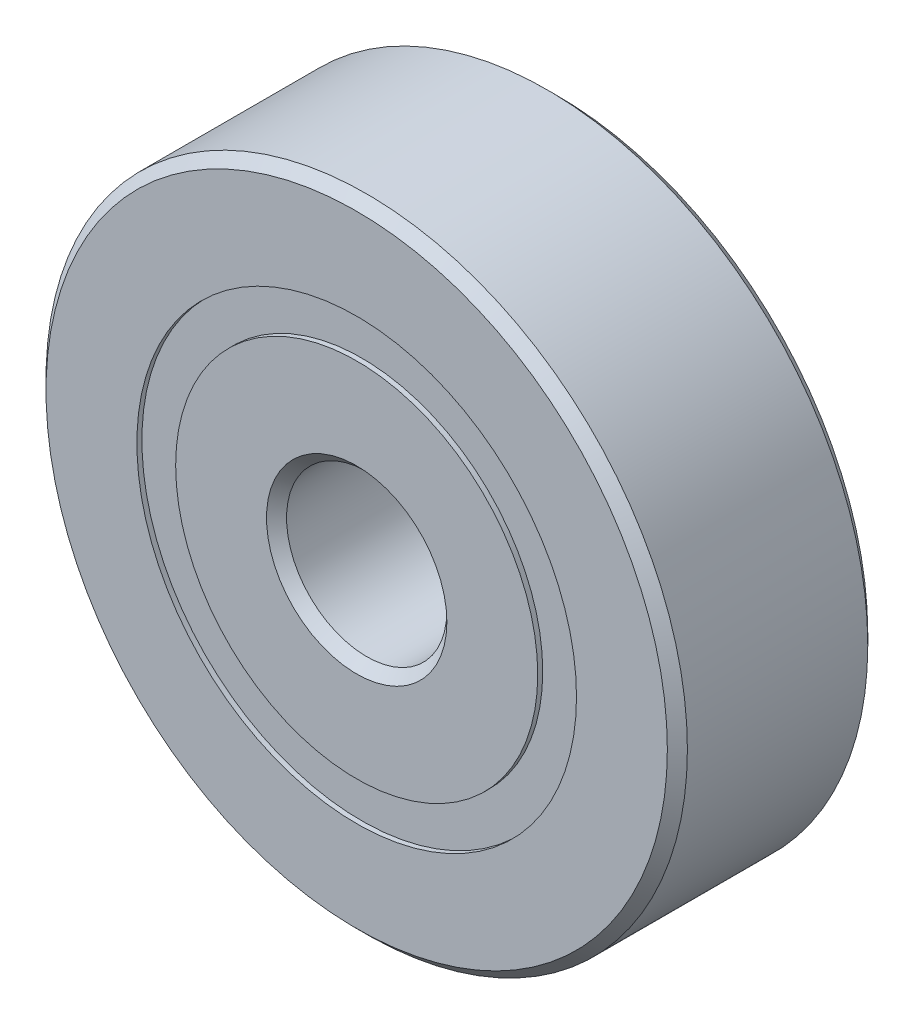
ISO-10303-21;
HEADER;
FILE_DESCRIPTION(('STEP AP214'),'2;1');
FILE_NAME('part.step','',(''),(''),'','','');
FILE_SCHEMA(('AUTOMOTIVE_DESIGN { 1 0 10303 214 1 1 1 1 }'));
ENDSEC;
DATA;
#1=APPLICATION_CONTEXT('core data for automotive mechanical design processes');
#2=APPLICATION_PROTOCOL_DEFINITION('international standard','automotive_design',2000,#1);
#3=PRODUCT_CONTEXT('',#1,'mechanical');
#4=PRODUCT('Part','Part','',(#3));
#5=PRODUCT_RELATED_PRODUCT_CATEGORY('part','',(#4));
#6=PRODUCT_DEFINITION_FORMATION('','',#4);
#7=PRODUCT_DEFINITION_CONTEXT('part definition',#1,'design');
#8=PRODUCT_DEFINITION('design','',#6,#7);
#9=PRODUCT_DEFINITION_SHAPE('','',#8);
#10=(LENGTH_UNIT() NAMED_UNIT(*) SI_UNIT(.MILLI.,.METRE.));
#11=(NAMED_UNIT(*) PLANE_ANGLE_UNIT() SI_UNIT($,.RADIAN.));
#12=(NAMED_UNIT(*) SI_UNIT($,.STERADIAN.) SOLID_ANGLE_UNIT());
#13=UNCERTAINTY_MEASURE_WITH_UNIT(LENGTH_MEASURE(1.E-05),#10,'distance_accuracy_value','');
#14=(GEOMETRIC_REPRESENTATION_CONTEXT(3) GLOBAL_UNCERTAINTY_ASSIGNED_CONTEXT((#13)) GLOBAL_UNIT_ASSIGNED_CONTEXT((#10,
#11,#12)) REPRESENTATION_CONTEXT('',''));
#15=CARTESIAN_POINT('',(0.,0.,0.));
#16=DIRECTION('',(0.,0.,1.));
#17=DIRECTION('',(1.,0.,0.));
#18=AXIS2_PLACEMENT_3D('',#15,#16,#17);
#19=CARTESIAN_POINT('',(0.,5.48351648351648,-2.375));
#20=DIRECTION('',(0.,0.,1.));
#21=DIRECTION('',(1.,0.,0.));
#22=AXIS2_PLACEMENT_3D('',#19,#20,#21);
#23=PLANE('',#22);
#24=CARTESIAN_POINT('',(0.,0.,-2.375));
#25=DIRECTION('',(0.,0.,1.));
#26=DIRECTION('',(1.,0.,0.));
#27=AXIS2_PLACEMENT_3D('',#24,#25,#26);
#28=CIRCLE('',#27,5.48351648351648);
#29=CARTESIAN_POINT('',(5.48351648351648,0.,-2.375));
#30=VERTEX_POINT('',#29);
#31=EDGE_CURVE('E57',#30,#30,#28,.T.);
#32=ORIENTED_EDGE('',*,*,#31,.F.);
#33=EDGE_LOOP('',(#32));
#34=FACE_BOUND('',#33,.T.);
#35=CARTESIAN_POINT('',(0.,0.,-2.375));
#36=DIRECTION('',(0.,0.,1.));
#37=DIRECTION('',(1.,0.,0.));
#38=AXIS2_PLACEMENT_3D('',#35,#36,#37);
#39=CIRCLE('',#38,4.51648351648352);
#40=CARTESIAN_POINT('',(4.51648351648352,0.,-2.375));
#41=VERTEX_POINT('',#40);
#42=EDGE_CURVE('E11',#41,#41,#39,.T.);
#43=ORIENTED_EDGE('',*,*,#42,.T.);
#44=EDGE_LOOP('',(#43));
#45=FACE_BOUND('',#44,.T.);
#46=ADVANCED_FACE('F43',(#34,#45),#23,.F.);
#47=CARTESIAN_POINT('',(0.,0.,2.5));
#48=DIRECTION('',(0.,0.,1.));
#49=DIRECTION('',(1.,0.,0.));
#50=AXIS2_PLACEMENT_3D('',#47,#48,#49);
#51=CYLINDRICAL_SURFACE('',#50,4.51648351648352);
#52=ORIENTED_EDGE('',*,*,#42,.F.);
#53=EDGE_LOOP('',(#52));
#54=FACE_BOUND('',#53,.T.);
#55=CARTESIAN_POINT('',(0.,0.,-1.21175743903915));
#56=DIRECTION('',(0.,0.,1.));
#57=DIRECTION('',(1.,0.,0.));
#58=AXIS2_PLACEMENT_3D('',#55,#56,#57);
#59=CIRCLE('',#58,4.51648351648352);
#60=CARTESIAN_POINT('',(4.51648351648352,0.,-1.21175743903915));
#61=VERTEX_POINT('',#60);
#62=EDGE_CURVE('E49',#61,#61,#59,.T.);
#63=ORIENTED_EDGE('',*,*,#62,.T.);
#64=EDGE_LOOP('',(#63));
#65=FACE_BOUND('',#64,.T.);
#66=ADVANCED_FACE('F66',(#54,#65),#51,.F.);
#67=CARTESIAN_POINT('',(0.,5.48351648351648,-1.21175743903915));
#68=DIRECTION('',(0.,0.,-1.));
#69=DIRECTION('',(-1.,0.,0.));
#70=AXIS2_PLACEMENT_3D('',#67,#68,#69);
#71=PLANE('',#70);
#72=ORIENTED_EDGE('',*,*,#62,.F.);
#73=EDGE_LOOP('',(#72));
#74=FACE_BOUND('',#73,.T.);
#75=CARTESIAN_POINT('',(0.,0.,-1.21175743903915));
#76=DIRECTION('',(0.,0.,1.));
#77=DIRECTION('',(1.,0.,0.));
#78=AXIS2_PLACEMENT_3D('',#75,#76,#77);
#79=CIRCLE('',#78,5.48351648351648);
#80=CARTESIAN_POINT('',(5.48351648351648,0.,-1.21175743903915));
#81=VERTEX_POINT('',#80);
#82=EDGE_CURVE('E53',#81,#81,#79,.T.);
#83=ORIENTED_EDGE('',*,*,#82,.T.);
#84=EDGE_LOOP('',(#83));
#85=FACE_BOUND('',#84,.T.);
#86=ADVANCED_FACE('F70',(#74,#85),#71,.F.);
#87=CARTESIAN_POINT('',(0.,0.,2.5));
#88=DIRECTION('',(0.,0.,1.));
#89=DIRECTION('',(1.,0.,0.));
#90=AXIS2_PLACEMENT_3D('',#87,#88,#89);
#91=CYLINDRICAL_SURFACE('',#90,5.48351648351648);
#92=ORIENTED_EDGE('',*,*,#82,.F.);
#93=EDGE_LOOP('',(#92));
#94=FACE_BOUND('',#93,.T.);
#95=ORIENTED_EDGE('',*,*,#31,.T.);
#96=EDGE_LOOP('',(#95));
#97=FACE_BOUND('',#96,.T.);
#98=ADVANCED_FACE('F63',(#94,#97),#91,.T.);
#99=CLOSED_SHELL('',(#46,#66,#86,#98));
#100=MANIFOLD_SOLID_BREP('B2',#99);
#101=CARTESIAN_POINT('',(0.,5.48351648351648,2.375));
#102=DIRECTION('',(0.,0.,-1.));
#103=DIRECTION('',(-1.,0.,0.));
#104=AXIS2_PLACEMENT_3D('',#101,#102,#103);
#105=PLANE('',#104);
#106=CARTESIAN_POINT('',(0.,0.,2.375));
#107=DIRECTION('',(0.,0.,1.));
#108=DIRECTION('',(1.,0.,0.));
#109=AXIS2_PLACEMENT_3D('',#106,#107,#108);
#110=CIRCLE('',#109,4.51648351648352);
#111=CARTESIAN_POINT('',(4.51648351648352,0.,2.375));
#112=VERTEX_POINT('',#111);
#113=EDGE_CURVE('E42',#112,#112,#110,.T.);
#114=ORIENTED_EDGE('',*,*,#113,.F.);
#115=EDGE_LOOP('',(#114));
#116=FACE_BOUND('',#115,.T.);
#117=CARTESIAN_POINT('',(0.,0.,2.375));
#118=DIRECTION('',(0.,0.,1.));
#119=DIRECTION('',(1.,0.,0.));
#120=AXIS2_PLACEMENT_3D('',#117,#118,#119);
#121=CIRCLE('',#120,5.48351648351648);
#122=CARTESIAN_POINT('',(5.48351648351648,0.,2.375));
#123=VERTEX_POINT('',#122);
#124=EDGE_CURVE('E124',#123,#123,#121,.T.);
#125=ORIENTED_EDGE('',*,*,#124,.T.);
#126=EDGE_LOOP('',(#125));
#127=FACE_BOUND('',#126,.T.);
#128=ADVANCED_FACE('F110',(#116,#127),#105,.F.);
#129=CARTESIAN_POINT('',(0.,0.,2.5));
#130=DIRECTION('',(0.,0.,1.));
#131=DIRECTION('',(1.,0.,0.));
#132=AXIS2_PLACEMENT_3D('',#129,#130,#131);
#133=CYLINDRICAL_SURFACE('',#132,4.51648351648352);
#134=CARTESIAN_POINT('',(0.,0.,1.21175743903915));
#135=DIRECTION('',(0.,0.,1.));
#136=DIRECTION('',(1.,0.,0.));
#137=AXIS2_PLACEMENT_3D('',#134,#135,#136);
#138=CIRCLE('',#137,4.51648351648352);
#139=CARTESIAN_POINT('',(4.51648351648352,0.,1.21175743903915));
#140=VERTEX_POINT('',#139);
#141=EDGE_CURVE('E116',#140,#140,#138,.T.);
#142=ORIENTED_EDGE('',*,*,#141,.F.);
#143=EDGE_LOOP('',(#142));
#144=FACE_BOUND('',#143,.T.);
#145=ORIENTED_EDGE('',*,*,#113,.T.);
#146=EDGE_LOOP('',(#145));
#147=FACE_BOUND('',#146,.T.);
#148=ADVANCED_FACE('F139',(#144,#147),#133,.F.);
#149=CARTESIAN_POINT('',(0.,5.48351648351648,1.21175743903915));
#150=DIRECTION('',(0.,0.,1.));
#151=DIRECTION('',(1.,0.,0.));
#152=AXIS2_PLACEMENT_3D('',#149,#150,#151);
#153=PLANE('',#152);
#154=CARTESIAN_POINT('',(0.,0.,1.21175743903915));
#155=DIRECTION('',(0.,0.,1.));
#156=DIRECTION('',(1.,0.,0.));
#157=AXIS2_PLACEMENT_3D('',#154,#155,#156);
#158=CIRCLE('',#157,5.48351648351648);
#159=CARTESIAN_POINT('',(5.48351648351648,0.,1.21175743903915));
#160=VERTEX_POINT('',#159);
#161=EDGE_CURVE('E120',#160,#160,#158,.T.);
#162=ORIENTED_EDGE('',*,*,#161,.F.);
#163=EDGE_LOOP('',(#162));
#164=FACE_BOUND('',#163,.T.);
#165=ORIENTED_EDGE('',*,*,#141,.T.);
#166=EDGE_LOOP('',(#165));
#167=FACE_BOUND('',#166,.T.);
#168=ADVANCED_FACE('F134',(#164,#167),#153,.F.);
#169=CARTESIAN_POINT('',(0.,0.,2.5));
#170=DIRECTION('',(0.,0.,1.));
#171=DIRECTION('',(1.,0.,0.));
#172=AXIS2_PLACEMENT_3D('',#169,#170,#171);
#173=CYLINDRICAL_SURFACE('',#172,5.48351648351648);
#174=ORIENTED_EDGE('',*,*,#124,.F.);
#175=EDGE_LOOP('',(#174));
#176=FACE_BOUND('',#175,.T.);
#177=ORIENTED_EDGE('',*,*,#161,.T.);
#178=EDGE_LOOP('',(#177));
#179=FACE_BOUND('',#178,.T.);
#180=ADVANCED_FACE('F131',(#176,#179),#173,.T.);
#181=CLOSED_SHELL('',(#128,#148,#168,#180));
#182=MANIFOLD_SOLID_BREP('B6',#181);
#183=CARTESIAN_POINT('',(-2.49999999999994,4.33012701892223,0.));
#184=DIRECTION('',(0.,0.,1.));
#185=DIRECTION('',(-0.499999999999989,0.866025403784445,0.));
#186=AXIS2_PLACEMENT_3D('',#183,#184,#185);
#187=SPHERICAL_SURFACE('',#186,1.21175743903915);
#188=CARTESIAN_POINT('',(-2.49999999999994,4.33012701892223,1.21175743903915));
#189=VERTEX_POINT('',#188);
#190=VERTEX_LOOP('',#189);
#191=FACE_BOUND('',#190,.T.);
#192=ADVANCED_FACE('F177',(#191),#187,.T.);
#193=CLOSED_SHELL('',(#192));
#194=MANIFOLD_SOLID_BREP('B37',#193);
#195=CARTESIAN_POINT('',(-4.33012701892216,2.50000000000005,0.));
#196=DIRECTION('',(0.,0.,1.));
#197=DIRECTION('',(-0.866025403784433,0.50000000000001,0.));
#198=AXIS2_PLACEMENT_3D('',#195,#196,#197);
#199=SPHERICAL_SURFACE('',#198,1.21175743903915);
#200=CARTESIAN_POINT('',(-4.33012701892216,2.50000000000005,1.21175743903915));
#201=VERTEX_POINT('',#200);
#202=VERTEX_LOOP('',#201);
#203=FACE_BOUND('',#202,.T.);
#204=ADVANCED_FACE('F197',(#203),#199,.T.);
#205=CLOSED_SHELL('',(#204));
#206=MANIFOLD_SOLID_BREP('B106',#205);
#207=CARTESIAN_POINT('',(-5.,0.,0.));
#208=DIRECTION('',(0.,0.,1.));
#209=DIRECTION('',(-1.,0.,0.));
#210=AXIS2_PLACEMENT_3D('',#207,#208,#209);
#211=SPHERICAL_SURFACE('',#210,1.21175743903915);
#212=CARTESIAN_POINT('',(-5.,0.,1.21175743903915));
#213=VERTEX_POINT('',#212);
#214=VERTEX_LOOP('',#213);
#215=FACE_BOUND('',#214,.T.);
#216=ADVANCED_FACE('F217',(#215),#211,.T.);
#217=CLOSED_SHELL('',(#216));
#218=MANIFOLD_SOLID_BREP('B173',#217);
#219=CARTESIAN_POINT('',(-4.33012701892222,-2.49999999999996,0.));
#220=DIRECTION('',(0.,0.,1.));
#221=DIRECTION('',(-0.866025403784443,-0.499999999999992,0.));
#222=AXIS2_PLACEMENT_3D('',#219,#220,#221);
#223=SPHERICAL_SURFACE('',#222,1.21175743903915);
#224=CARTESIAN_POINT('',(-4.33012701892222,-2.49999999999996,1.21175743903915));
#225=VERTEX_POINT('',#224);
#226=VERTEX_LOOP('',#225);
#227=FACE_BOUND('',#226,.T.);
#228=ADVANCED_FACE('F237',(#227),#223,.T.);
#229=CLOSED_SHELL('',(#228));
#230=MANIFOLD_SOLID_BREP('B193',#229);
#231=CARTESIAN_POINT('',(-2.50000000000004,-4.33012701892217,0.));
#232=DIRECTION('',(0.,0.,1.));
#233=DIRECTION('',(-0.500000000000007,-0.866025403784435,0.));
#234=AXIS2_PLACEMENT_3D('',#231,#232,#233);
#235=SPHERICAL_SURFACE('',#234,1.21175743903915);
#236=CARTESIAN_POINT('',(-2.50000000000004,-4.33012701892217,1.21175743903915));
#237=VERTEX_POINT('',#236);
#238=VERTEX_LOOP('',#237);
#239=FACE_BOUND('',#238,.T.);
#240=ADVANCED_FACE('F257',(#239),#235,.T.);
#241=CLOSED_SHELL('',(#240));
#242=MANIFOLD_SOLID_BREP('B213',#241);
#243=CARTESIAN_POINT('',(0.,-5.,0.));
#244=DIRECTION('',(0.,0.,1.));
#245=DIRECTION('',(0.,-1.,0.));
#246=AXIS2_PLACEMENT_3D('',#243,#244,#245);
#247=SPHERICAL_SURFACE('',#246,1.21175743903915);
#248=CARTESIAN_POINT('',(0.,-5.,1.21175743903915));
#249=VERTEX_POINT('',#248);
#250=VERTEX_LOOP('',#249);
#251=FACE_BOUND('',#250,.T.);
#252=ADVANCED_FACE('F277',(#251),#247,.T.);
#253=CLOSED_SHELL('',(#252));
#254=MANIFOLD_SOLID_BREP('B233',#253);
#255=CARTESIAN_POINT('',(2.49999999999997,-4.33012701892221,0.));
#256=DIRECTION('',(0.,0.,1.));
#257=DIRECTION('',(0.499999999999995,-0.866025403784442,0.));
#258=AXIS2_PLACEMENT_3D('',#255,#256,#257);
#259=SPHERICAL_SURFACE('',#258,1.21175743903915);
#260=CARTESIAN_POINT('',(2.49999999999997,-4.33012701892221,1.21175743903915));
#261=VERTEX_POINT('',#260);
#262=VERTEX_LOOP('',#261);
#263=FACE_BOUND('',#262,.T.);
#264=ADVANCED_FACE('F297',(#263),#259,.T.);
#265=CLOSED_SHELL('',(#264));
#266=MANIFOLD_SOLID_BREP('B253',#265);
#267=CARTESIAN_POINT('',(4.33012701892218,-2.50000000000002,0.));
#268=DIRECTION('',(0.,0.,1.));
#269=DIRECTION('',(0.866025403784436,-0.500000000000004,0.));
#270=AXIS2_PLACEMENT_3D('',#267,#268,#269);
#271=SPHERICAL_SURFACE('',#270,1.21175743903915);
#272=CARTESIAN_POINT('',(4.33012701892218,-2.50000000000002,1.21175743903915));
#273=VERTEX_POINT('',#272);
#274=VERTEX_LOOP('',#273);
#275=FACE_BOUND('',#274,.T.);
#276=ADVANCED_FACE('F317',(#275),#271,.T.);
#277=CLOSED_SHELL('',(#276));
#278=MANIFOLD_SOLID_BREP('B273',#277);
#279=CARTESIAN_POINT('',(5.,0.,0.));
#280=DIRECTION('',(0.,0.,1.));
#281=DIRECTION('',(1.,0.,0.));
#282=AXIS2_PLACEMENT_3D('',#279,#280,#281);
#283=SPHERICAL_SURFACE('',#282,1.21175743903915);
#284=CARTESIAN_POINT('',(5.,0.,1.21175743903915));
#285=VERTEX_POINT('',#284);
#286=VERTEX_LOOP('',#285);
#287=FACE_BOUND('',#286,.T.);
#288=ADVANCED_FACE('F337',(#287),#283,.T.);
#289=CLOSED_SHELL('',(#288));
#290=MANIFOLD_SOLID_BREP('B293',#289);
#291=CARTESIAN_POINT('',(4.3301270189222,2.49999999999999,0.));
#292=DIRECTION('',(0.,0.,1.));
#293=DIRECTION('',(0.86602540378444,0.499999999999998,0.));
#294=AXIS2_PLACEMENT_3D('',#291,#292,#293);
#295=SPHERICAL_SURFACE('',#294,1.21175743903915);
#296=CARTESIAN_POINT('',(4.3301270189222,2.49999999999999,1.21175743903915));
#297=VERTEX_POINT('',#296);
#298=VERTEX_LOOP('',#297);
#299=FACE_BOUND('',#298,.T.);
#300=ADVANCED_FACE('F357',(#299),#295,.T.);
#301=CLOSED_SHELL('',(#300));
#302=MANIFOLD_SOLID_BREP('B313',#301);
#303=CARTESIAN_POINT('',(2.50000000000001,4.33012701892219,0.));
#304=DIRECTION('',(0.,0.,1.));
#305=DIRECTION('',(0.500000000000001,0.866025403784438,0.));
#306=AXIS2_PLACEMENT_3D('',#303,#304,#305);
#307=SPHERICAL_SURFACE('',#306,1.21175743903915);
#308=CARTESIAN_POINT('',(2.50000000000001,4.33012701892219,1.21175743903915));
#309=VERTEX_POINT('',#308);
#310=VERTEX_LOOP('',#309);
#311=FACE_BOUND('',#310,.T.);
#312=ADVANCED_FACE('F377',(#311),#307,.T.);
#313=CLOSED_SHELL('',(#312));
#314=MANIFOLD_SOLID_BREP('B333',#313);
#315=CARTESIAN_POINT('',(0.,5.,0.));
#316=DIRECTION('',(0.,0.,1.));
#317=DIRECTION('',(0.,1.,0.));
#318=AXIS2_PLACEMENT_3D('',#315,#316,#317);
#319=SPHERICAL_SURFACE('',#318,1.21175743903915);
#320=CARTESIAN_POINT('',(0.,5.,1.21175743903915));
#321=VERTEX_POINT('',#320);
#322=VERTEX_LOOP('',#321);
#323=FACE_BOUND('',#322,.T.);
#324=ADVANCED_FACE('F399',(#323),#319,.T.);
#325=CLOSED_SHELL('',(#324));
#326=MANIFOLD_SOLID_BREP('B353',#325);
#327=CARTESIAN_POINT('',(0.,4.51648351648352,2.5));
#328=DIRECTION('',(0.,0.,-1.));
#329=DIRECTION('',(-1.,0.,0.));
#330=AXIS2_PLACEMENT_3D('',#327,#328,#329);
#331=PLANE('',#330);
#332=CARTESIAN_POINT('',(0.,0.,2.5));
#333=DIRECTION('',(0.,0.,1.));
#334=DIRECTION('',(1.,0.,0.));
#335=AXIS2_PLACEMENT_3D('',#332,#333,#334);
#336=CIRCLE('',#335,2.25);
#337=CARTESIAN_POINT('',(2.25,0.,2.5));
#338=VERTEX_POINT('',#337);
#339=EDGE_CURVE('E446',#338,#338,#336,.T.);
#340=ORIENTED_EDGE('',*,*,#339,.F.);
#341=EDGE_LOOP('',(#340));
#342=FACE_BOUND('',#341,.T.);
#343=CARTESIAN_POINT('',(0.,0.,2.5));
#344=DIRECTION('',(0.,0.,1.));
#345=DIRECTION('',(1.,0.,0.));
#346=AXIS2_PLACEMENT_3D('',#343,#344,#345);
#347=CIRCLE('',#346,4.51648351648352);
#348=CARTESIAN_POINT('',(4.51648351648352,0.,2.5));
#349=VERTEX_POINT('',#348);
#350=EDGE_CURVE('E398',#349,#349,#347,.T.);
#351=ORIENTED_EDGE('',*,*,#350,.T.);
#352=EDGE_LOOP('',(#351));
#353=FACE_BOUND('',#352,.T.);
#354=ADVANCED_FACE('F418',(#342,#353),#331,.F.);
#355=CARTESIAN_POINT('',(0.,0.,2.5));
#356=DIRECTION('',(0.,0.,1.));
#357=DIRECTION('',(1.,0.,0.));
#358=AXIS2_PLACEMENT_3D('',#355,#356,#357);
#359=CYLINDRICAL_SURFACE('',#358,4.51648351648352);
#360=ORIENTED_EDGE('',*,*,#350,.F.);
#361=EDGE_LOOP('',(#360));
#362=FACE_BOUND('',#361,.T.);
#363=CARTESIAN_POINT('',(0.,0.,1.11111111111111));
#364=DIRECTION('',(0.,0.,1.));
#365=DIRECTION('',(1.,0.,0.));
#366=AXIS2_PLACEMENT_3D('',#363,#364,#365);
#367=CIRCLE('',#366,4.51648351648352);
#368=CARTESIAN_POINT('',(4.51648351648352,0.,1.11111111111111));
#369=VERTEX_POINT('',#368);
#370=EDGE_CURVE('E424',#369,#369,#367,.T.);
#371=ORIENTED_EDGE('',*,*,#370,.T.);
#372=EDGE_LOOP('',(#371));
#373=FACE_BOUND('',#372,.T.);
#374=ADVANCED_FACE('F453',(#362,#373),#359,.T.);
#375=CARTESIAN_POINT('',(0.,0.,0.));
#376=DIRECTION('',(0.,0.,1.));
#377=DIRECTION('',(1.,0.,0.));
#378=AXIS2_PLACEMENT_3D('',#375,#376,#377);
#379=TOROIDAL_SURFACE('',#378,5.,1.21175743903915);
#380=ORIENTED_EDGE('',*,*,#370,.F.);
#381=EDGE_LOOP('',(#380));
#382=FACE_BOUND('',#381,.T.);
#383=CARTESIAN_POINT('',(0.,0.,-1.11111111111111));
#384=DIRECTION('',(0.,0.,1.));
#385=DIRECTION('',(1.,0.,0.));
#386=AXIS2_PLACEMENT_3D('',#383,#384,#385);
#387=CIRCLE('',#386,4.51648351648352);
#388=CARTESIAN_POINT('',(4.51648351648352,0.,-1.11111111111111));
#389=VERTEX_POINT('',#388);
#390=EDGE_CURVE('E428',#389,#389,#387,.T.);
#391=ORIENTED_EDGE('',*,*,#390,.T.);
#392=EDGE_LOOP('',(#391));
#393=FACE_BOUND('',#392,.T.);
#394=ADVANCED_FACE('F457',(#382,#393),#379,.F.);
#395=CARTESIAN_POINT('',(0.,0.,2.5));
#396=DIRECTION('',(0.,0.,1.));
#397=DIRECTION('',(1.,0.,0.));
#398=AXIS2_PLACEMENT_3D('',#395,#396,#397);
#399=CYLINDRICAL_SURFACE('',#398,4.51648351648352);
#400=ORIENTED_EDGE('',*,*,#390,.F.);
#401=EDGE_LOOP('',(#400));
#402=FACE_BOUND('',#401,.T.);
#403=CARTESIAN_POINT('',(0.,0.,-2.5));
#404=DIRECTION('',(0.,0.,1.));
#405=DIRECTION('',(1.,0.,0.));
#406=AXIS2_PLACEMENT_3D('',#403,#404,#405);
#407=CIRCLE('',#406,4.51648351648352);
#408=CARTESIAN_POINT('',(4.51648351648352,0.,-2.5));
#409=VERTEX_POINT('',#408);
#410=EDGE_CURVE('E432',#409,#409,#407,.T.);
#411=ORIENTED_EDGE('',*,*,#410,.T.);
#412=EDGE_LOOP('',(#411));
#413=FACE_BOUND('',#412,.T.);
#414=ADVANCED_FACE('F462',(#402,#413),#399,.T.);
#415=CARTESIAN_POINT('',(0.,2.25,-2.5));
#416=DIRECTION('',(0.,0.,1.));
#417=DIRECTION('',(1.,0.,0.));
#418=AXIS2_PLACEMENT_3D('',#415,#416,#417);
#419=PLANE('',#418);
#420=ORIENTED_EDGE('',*,*,#410,.F.);
#421=EDGE_LOOP('',(#420));
#422=FACE_BOUND('',#421,.T.);
#423=CARTESIAN_POINT('',(0.,0.,-2.5));
#424=DIRECTION('',(0.,0.,1.));
#425=DIRECTION('',(1.,0.,0.));
#426=AXIS2_PLACEMENT_3D('',#423,#424,#425);
#427=CIRCLE('',#426,2.25);
#428=CARTESIAN_POINT('',(2.25,0.,-2.5));
#429=VERTEX_POINT('',#428);
#430=EDGE_CURVE('E437',#429,#429,#427,.T.);
#431=ORIENTED_EDGE('',*,*,#430,.T.);
#432=EDGE_LOOP('',(#431));
#433=FACE_BOUND('',#432,.T.);
#434=ADVANCED_FACE('F468',(#422,#433),#419,.F.);
#435=CARTESIAN_POINT('',(0.,0.,-2.25));
#436=DIRECTION('',(0.,0.,-1.));
#437=DIRECTION('',(-1.,0.,0.));
#438=AXIS2_PLACEMENT_3D('',#435,#436,#437);
#439=CONICAL_SURFACE('',#438,2.,0.785398163397435);
#440=ORIENTED_EDGE('',*,*,#430,.F.);
#441=EDGE_LOOP('',(#440));
#442=FACE_BOUND('',#441,.T.);
#443=CARTESIAN_POINT('',(0.,0.,-2.25));
#444=DIRECTION('',(0.,0.,1.));
#445=DIRECTION('',(1.,0.,0.));
#446=AXIS2_PLACEMENT_3D('',#443,#444,#445);
#447=CIRCLE('',#446,2.);
#448=CARTESIAN_POINT('',(2.,0.,-2.25));
#449=VERTEX_POINT('',#448);
#450=EDGE_CURVE('E440',#449,#449,#447,.T.);
#451=ORIENTED_EDGE('',*,*,#450,.T.);
#452=EDGE_LOOP('',(#451));
#453=FACE_BOUND('',#452,.T.);
#454=ADVANCED_FACE('F472',(#442,#453),#439,.F.);
#455=CARTESIAN_POINT('',(0.,0.,2.5));
#456=DIRECTION('',(0.,0.,1.));
#457=DIRECTION('',(1.,0.,0.));
#458=AXIS2_PLACEMENT_3D('',#455,#456,#457);
#459=CYLINDRICAL_SURFACE('',#458,2.);
#460=ORIENTED_EDGE('',*,*,#450,.F.);
#461=EDGE_LOOP('',(#460));
#462=FACE_BOUND('',#461,.T.);
#463=CARTESIAN_POINT('',(0.,0.,2.25));
#464=DIRECTION('',(0.,0.,1.));
#465=DIRECTION('',(1.,0.,0.));
#466=AXIS2_PLACEMENT_3D('',#463,#464,#465);
#467=CIRCLE('',#466,2.);
#468=CARTESIAN_POINT('',(2.,0.,2.25));
#469=VERTEX_POINT('',#468);
#470=EDGE_CURVE('E443',#469,#469,#467,.T.);
#471=ORIENTED_EDGE('',*,*,#470,.T.);
#472=EDGE_LOOP('',(#471));
#473=FACE_BOUND('',#472,.T.);
#474=ADVANCED_FACE('F476',(#462,#473),#459,.F.);
#475=CARTESIAN_POINT('',(0.,0.,2.5));
#476=DIRECTION('',(0.,0.,1.));
#477=DIRECTION('',(1.,0.,0.));
#478=AXIS2_PLACEMENT_3D('',#475,#476,#477);
#479=CONICAL_SURFACE('',#478,2.25,0.785398163397459);
#480=ORIENTED_EDGE('',*,*,#470,.F.);
#481=EDGE_LOOP('',(#480));
#482=FACE_BOUND('',#481,.T.);
#483=ORIENTED_EDGE('',*,*,#339,.T.);
#484=EDGE_LOOP('',(#483));
#485=FACE_BOUND('',#484,.T.);
#486=ADVANCED_FACE('F450',(#482,#485),#479,.F.);
#487=CLOSED_SHELL('',(#354,#374,#394,#414,#434,#454,#474,#486));
#488=MANIFOLD_SOLID_BREP('B373',#487);
#489=CARTESIAN_POINT('',(0.,0.,2.25));
#490=DIRECTION('',(0.,0.,-1.));
#491=DIRECTION('',(-1.,0.,0.));
#492=AXIS2_PLACEMENT_3D('',#489,#490,#491);
#493=CONICAL_SURFACE('',#492,8.,0.785398163397447);
#494=CARTESIAN_POINT('',(0.,0.,2.5));
#495=DIRECTION('',(0.,0.,1.));
#496=DIRECTION('',(1.,0.,0.));
#497=AXIS2_PLACEMENT_3D('',#494,#495,#496);
#498=CIRCLE('',#497,7.75);
#499=CARTESIAN_POINT('',(7.75,0.,2.5));
#500=VERTEX_POINT('',#499);
#501=EDGE_CURVE('E567',#500,#500,#498,.T.);
#502=ORIENTED_EDGE('',*,*,#501,.F.);
#503=EDGE_LOOP('',(#502));
#504=FACE_BOUND('',#503,.T.);
#505=CARTESIAN_POINT('',(0.,0.,2.25));
#506=DIRECTION('',(0.,0.,1.));
#507=DIRECTION('',(1.,0.,0.));
#508=AXIS2_PLACEMENT_3D('',#505,#506,#507);
#509=CIRCLE('',#508,8.);
#510=CARTESIAN_POINT('',(8.,0.,2.25));
#511=VERTEX_POINT('',#510);
#512=EDGE_CURVE('E417',#511,#511,#509,.T.);
#513=ORIENTED_EDGE('',*,*,#512,.T.);
#514=EDGE_LOOP('',(#513));
#515=FACE_BOUND('',#514,.T.);
#516=ADVANCED_FACE('F539',(#504,#515),#493,.T.);
#517=CARTESIAN_POINT('',(0.,0.,2.5));
#518=DIRECTION('',(0.,0.,1.));
#519=DIRECTION('',(1.,0.,0.));
#520=AXIS2_PLACEMENT_3D('',#517,#518,#519);
#521=CYLINDRICAL_SURFACE('',#520,8.);
#522=ORIENTED_EDGE('',*,*,#512,.F.);
#523=EDGE_LOOP('',(#522));
#524=FACE_BOUND('',#523,.T.);
#525=CARTESIAN_POINT('',(0.,0.,-2.25));
#526=DIRECTION('',(0.,0.,1.));
#527=DIRECTION('',(1.,0.,0.));
#528=AXIS2_PLACEMENT_3D('',#525,#526,#527);
#529=CIRCLE('',#528,8.);
#530=CARTESIAN_POINT('',(8.,0.,-2.25));
#531=VERTEX_POINT('',#530);
#532=EDGE_CURVE('E545',#531,#531,#529,.T.);
#533=ORIENTED_EDGE('',*,*,#532,.T.);
#534=EDGE_LOOP('',(#533));
#535=FACE_BOUND('',#534,.T.);
#536=ADVANCED_FACE('F574',(#524,#535),#521,.T.);
#537=CARTESIAN_POINT('',(0.,0.,-2.5));
#538=DIRECTION('',(0.,0.,1.));
#539=DIRECTION('',(1.,0.,0.));
#540=AXIS2_PLACEMENT_3D('',#537,#538,#539);
#541=CONICAL_SURFACE('',#540,7.75,0.785398163397443);
#542=ORIENTED_EDGE('',*,*,#532,.F.);
#543=EDGE_LOOP('',(#542));
#544=FACE_BOUND('',#543,.T.);
#545=CARTESIAN_POINT('',(0.,0.,-2.5));
#546=DIRECTION('',(0.,0.,1.));
#547=DIRECTION('',(1.,0.,0.));
#548=AXIS2_PLACEMENT_3D('',#545,#546,#547);
#549=CIRCLE('',#548,7.75);
#550=CARTESIAN_POINT('',(7.75,0.,-2.5));
#551=VERTEX_POINT('',#550);
#552=EDGE_CURVE('E549',#551,#551,#549,.T.);
#553=ORIENTED_EDGE('',*,*,#552,.T.);
#554=EDGE_LOOP('',(#553));
#555=FACE_BOUND('',#554,.T.);
#556=ADVANCED_FACE('F578',(#544,#555),#541,.T.);
#557=CARTESIAN_POINT('',(0.,7.75,-2.5));
#558=DIRECTION('',(0.,0.,1.));
#559=DIRECTION('',(1.,0.,0.));
#560=AXIS2_PLACEMENT_3D('',#557,#558,#559);
#561=PLANE('',#560);
#562=ORIENTED_EDGE('',*,*,#552,.F.);
#563=EDGE_LOOP('',(#562));
#564=FACE_BOUND('',#563,.T.);
#565=CARTESIAN_POINT('',(0.,0.,-2.5));
#566=DIRECTION('',(0.,0.,1.));
#567=DIRECTION('',(1.,0.,0.));
#568=AXIS2_PLACEMENT_3D('',#565,#566,#567);
#569=CIRCLE('',#568,5.48351648351648);
#570=CARTESIAN_POINT('',(5.48351648351648,0.,-2.5));
#571=VERTEX_POINT('',#570);
#572=EDGE_CURVE('E553',#571,#571,#569,.T.);
#573=ORIENTED_EDGE('',*,*,#572,.T.);
#574=EDGE_LOOP('',(#573));
#575=FACE_BOUND('',#574,.T.);
#576=ADVANCED_FACE('F583',(#564,#575),#561,.F.);
#577=CARTESIAN_POINT('',(0.,0.,2.5));
#578=DIRECTION('',(0.,0.,1.));
#579=DIRECTION('',(1.,0.,0.));
#580=AXIS2_PLACEMENT_3D('',#577,#578,#579);
#581=CYLINDRICAL_SURFACE('',#580,5.48351648351648);
#582=ORIENTED_EDGE('',*,*,#572,.F.);
#583=EDGE_LOOP('',(#582));
#584=FACE_BOUND('',#583,.T.);
#585=CARTESIAN_POINT('',(0.,0.,-1.11111111111111));
#586=DIRECTION('',(0.,0.,1.));
#587=DIRECTION('',(1.,0.,0.));
#588=AXIS2_PLACEMENT_3D('',#585,#586,#587);
#589=CIRCLE('',#588,5.48351648351648);
#590=CARTESIAN_POINT('',(5.48351648351648,0.,-1.11111111111111));
#591=VERTEX_POINT('',#590);
#592=EDGE_CURVE('E558',#591,#591,#589,.T.);
#593=ORIENTED_EDGE('',*,*,#592,.T.);
#594=EDGE_LOOP('',(#593));
#595=FACE_BOUND('',#594,.T.);
#596=ADVANCED_FACE('F589',(#584,#595),#581,.F.);
#597=CARTESIAN_POINT('',(0.,0.,0.));
#598=DIRECTION('',(0.,0.,1.));
#599=DIRECTION('',(1.,0.,0.));
#600=AXIS2_PLACEMENT_3D('',#597,#598,#599);
#601=TOROIDAL_SURFACE('',#600,5.,1.21175743903915);
#602=ORIENTED_EDGE('',*,*,#592,.F.);
#603=EDGE_LOOP('',(#602));
#604=FACE_BOUND('',#603,.T.);
#605=CARTESIAN_POINT('',(0.,0.,1.11111111111111));
#606=DIRECTION('',(0.,0.,1.));
#607=DIRECTION('',(1.,0.,0.));
#608=AXIS2_PLACEMENT_3D('',#605,#606,#607);
#609=CIRCLE('',#608,5.48351648351648);
#610=CARTESIAN_POINT('',(5.48351648351648,0.,1.11111111111111));
#611=VERTEX_POINT('',#610);
#612=EDGE_CURVE('E561',#611,#611,#609,.T.);
#613=ORIENTED_EDGE('',*,*,#612,.T.);
#614=EDGE_LOOP('',(#613));
#615=FACE_BOUND('',#614,.T.);
#616=ADVANCED_FACE('F593',(#604,#615),#601,.F.);
#617=CARTESIAN_POINT('',(0.,0.,2.5));
#618=DIRECTION('',(0.,0.,1.));
#619=DIRECTION('',(1.,0.,0.));
#620=AXIS2_PLACEMENT_3D('',#617,#618,#619);
#621=CYLINDRICAL_SURFACE('',#620,5.48351648351648);
#622=ORIENTED_EDGE('',*,*,#612,.F.);
#623=EDGE_LOOP('',(#622));
#624=FACE_BOUND('',#623,.T.);
#625=CARTESIAN_POINT('',(0.,0.,2.5));
#626=DIRECTION('',(0.,0.,1.));
#627=DIRECTION('',(1.,0.,0.));
#628=AXIS2_PLACEMENT_3D('',#625,#626,#627);
#629=CIRCLE('',#628,5.48351648351648);
#630=CARTESIAN_POINT('',(5.48351648351648,0.,2.5));
#631=VERTEX_POINT('',#630);
#632=EDGE_CURVE('E564',#631,#631,#629,.T.);
#633=ORIENTED_EDGE('',*,*,#632,.T.);
#634=EDGE_LOOP('',(#633));
#635=FACE_BOUND('',#634,.T.);
#636=ADVANCED_FACE('F597',(#624,#635),#621,.F.);
#637=CARTESIAN_POINT('',(0.,7.75,2.5));
#638=DIRECTION('',(0.,0.,-1.));
#639=DIRECTION('',(-1.,0.,0.));
#640=AXIS2_PLACEMENT_3D('',#637,#638,#639);
#641=PLANE('',#640);
#642=ORIENTED_EDGE('',*,*,#632,.F.);
#643=EDGE_LOOP('',(#642));
#644=FACE_BOUND('',#643,.T.);
#645=ORIENTED_EDGE('',*,*,#501,.T.);
#646=EDGE_LOOP('',(#645));
#647=FACE_BOUND('',#646,.T.);
#648=ADVANCED_FACE('F571',(#644,#647),#641,.F.);
#649=CLOSED_SHELL('',(#516,#536,#556,#576,#596,#616,#636,#648));
#650=MANIFOLD_SOLID_BREP('B393',#649);
#651=ADVANCED_BREP_SHAPE_REPRESENTATION('',(#18,#100,#182,#194,#206,#218,#230,#242,#254,#266,
#278,#290,#302,#314,#326,#488,#650),#14);
#652=SHAPE_DEFINITION_REPRESENTATION(#9,#651);
ENDSEC;
END-ISO-10303-21;
